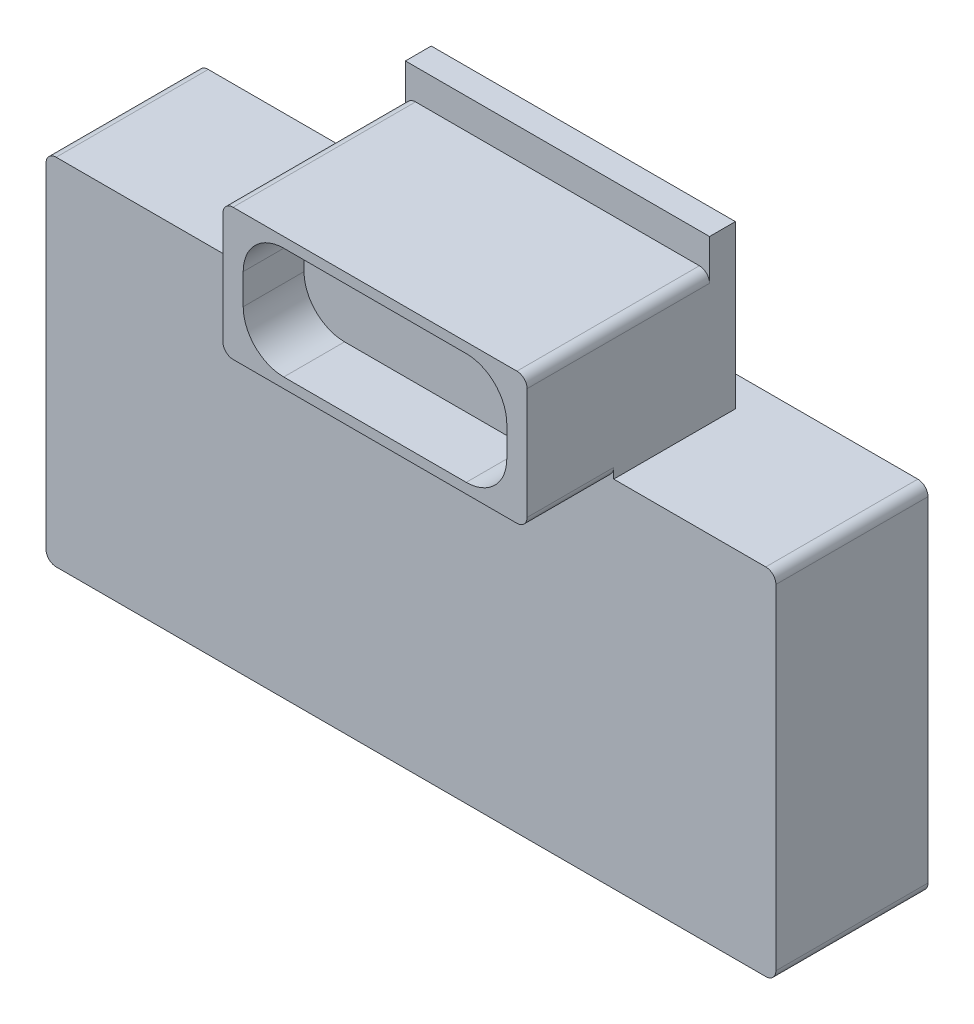
ISO-10303-21;
HEADER;
FILE_DESCRIPTION(('STEP AP214'),'2;1');
FILE_NAME('part.step','',(''),(''),'','','');
FILE_SCHEMA(('AUTOMOTIVE_DESIGN { 1 0 10303 214 1 1 1 1 }'));
ENDSEC;
DATA;
#1=APPLICATION_CONTEXT('core data for automotive mechanical design processes');
#2=APPLICATION_PROTOCOL_DEFINITION('international standard','automotive_design',2000,#1);
#3=PRODUCT_CONTEXT('',#1,'mechanical');
#4=PRODUCT('Part','Part','',(#3));
#5=PRODUCT_RELATED_PRODUCT_CATEGORY('part','',(#4));
#6=PRODUCT_DEFINITION_FORMATION('','',#4);
#7=PRODUCT_DEFINITION_CONTEXT('part definition',#1,'design');
#8=PRODUCT_DEFINITION('design','',#6,#7);
#9=PRODUCT_DEFINITION_SHAPE('','',#8);
#10=(LENGTH_UNIT() NAMED_UNIT(*) SI_UNIT(.MILLI.,.METRE.));
#11=(NAMED_UNIT(*) PLANE_ANGLE_UNIT() SI_UNIT($,.RADIAN.));
#12=(NAMED_UNIT(*) SI_UNIT($,.STERADIAN.) SOLID_ANGLE_UNIT());
#13=UNCERTAINTY_MEASURE_WITH_UNIT(LENGTH_MEASURE(1.E-05),#10,'distance_accuracy_value','');
#14=(GEOMETRIC_REPRESENTATION_CONTEXT(3) GLOBAL_UNCERTAINTY_ASSIGNED_CONTEXT((#13)) GLOBAL_UNIT_ASSIGNED_CONTEXT((#10,
#11,#12)) REPRESENTATION_CONTEXT('',''));
#15=CARTESIAN_POINT('',(0.,0.,0.));
#16=DIRECTION('',(0.,0.,1.));
#17=DIRECTION('',(1.,0.,0.));
#18=AXIS2_PLACEMENT_3D('',#15,#16,#17);
#19=CARTESIAN_POINT('',(0.,35.,15.));
#20=DIRECTION('',(0.,-1.,0.));
#21=DIRECTION('',(0.,0.,-1.));
#22=AXIS2_PLACEMENT_3D('',#19,#20,#21);
#23=PLANE('',#22);
#24=DIRECTION('',(-1.,0.,0.));
#25=VECTOR('',#24,1.);
#26=CARTESIAN_POINT('',(0.,35.,0.));
#27=LINE('',#26,#25);
#28=CARTESIAN_POINT('',(71.,35.,0.));
#29=VERTEX_POINT('',#28);
#30=CARTESIAN_POINT('',(1.,35.,0.));
#31=VERTEX_POINT('',#30);
#32=EDGE_CURVE('E281',#29,#31,#27,.T.);
#33=ORIENTED_EDGE('',*,*,#32,.T.);
#34=DIRECTION('',(0.,0.,-1.));
#35=VECTOR('',#34,1.);
#36=CARTESIAN_POINT('',(1.,35.,15.));
#37=LINE('',#36,#35);
#38=CARTESIAN_POINT('',(1.,35.,15.));
#39=VERTEX_POINT('',#38);
#40=EDGE_CURVE('E357',#31,#39,#37,.F.);
#41=ORIENTED_EDGE('',*,*,#40,.T.);
#42=DIRECTION('',(-1.,0.,0.));
#43=VECTOR('',#42,1.);
#44=CARTESIAN_POINT('',(0.,35.,15.));
#45=LINE('',#44,#43);
#46=CARTESIAN_POINT('',(22.,35.,15.));
#47=VERTEX_POINT('',#46);
#48=EDGE_CURVE('E251',#47,#39,#45,.T.);
#49=ORIENTED_EDGE('',*,*,#48,.F.);
#50=DIRECTION('',(0.,0.,1.));
#51=VECTOR('',#50,1.);
#52=CARTESIAN_POINT('',(22.,35.,3.));
#53=LINE('',#52,#51);
#54=CARTESIAN_POINT('',(22.,35.,3.));
#55=VERTEX_POINT('',#54);
#56=EDGE_CURVE('E336',#47,#55,#53,.F.);
#57=ORIENTED_EDGE('',*,*,#56,.T.);
#58=DIRECTION('',(-1.,0.,0.));
#59=VECTOR('',#58,1.);
#60=CARTESIAN_POINT('',(26.,35.,3.));
#61=LINE('',#60,#59);
#62=CARTESIAN_POINT('',(56.,35.,3.));
#63=VERTEX_POINT('',#62);
#64=EDGE_CURVE('E255',#63,#55,#61,.T.);
#65=ORIENTED_EDGE('',*,*,#64,.F.);
#66=DIRECTION('',(0.,0.,-1.));
#67=VECTOR('',#66,1.);
#68=CARTESIAN_POINT('',(56.,35.,3.));
#69=LINE('',#68,#67);
#70=CARTESIAN_POINT('',(56.,35.,15.));
#71=VERTEX_POINT('',#70);
#72=EDGE_CURVE('E233',#71,#63,#69,.T.);
#73=ORIENTED_EDGE('',*,*,#72,.F.);
#74=CARTESIAN_POINT('',(71.,35.,15.));
#75=VERTEX_POINT('',#74);
#76=EDGE_CURVE('E241',#75,#71,#45,.T.);
#77=ORIENTED_EDGE('',*,*,#76,.F.);
#78=DIRECTION('',(0.,0.,-1.));
#79=VECTOR('',#78,1.);
#80=CARTESIAN_POINT('',(71.,35.,15.));
#81=LINE('',#80,#79);
#82=EDGE_CURVE('E355',#75,#29,#81,.T.);
#83=ORIENTED_EDGE('',*,*,#82,.T.);
#84=EDGE_LOOP('',(#33,#41,#49,#57,#65,#73,#77,#83));
#85=FACE_BOUND('',#84,.T.);
#86=ADVANCED_FACE('F35',(#85),#23,.F.);
#87=CARTESIAN_POINT('',(26.,51.,5.54901565701342));
#88=DIRECTION('',(0.,0.,-1.));
#89=DIRECTION('',(-1.,0.,0.));
#90=AXIS2_PLACEMENT_3D('',#87,#88,#89);
#91=PLANE('',#90);
#92=DIRECTION('',(-1.,0.,0.));
#93=VECTOR('',#92,1.);
#94=CARTESIAN_POINT('',(26.,48.,5.54901565701342));
#95=LINE('',#94,#93);
#96=CARTESIAN_POINT('',(55.,48.,5.54901565701342));
#97=VERTEX_POINT('',#96);
#98=CARTESIAN_POINT('',(27.,48.,5.54901565701342));
#99=VERTEX_POINT('',#98);
#100=EDGE_CURVE('E406',#97,#99,#95,.T.);
#101=ORIENTED_EDGE('',*,*,#100,.F.);
#102=CARTESIAN_POINT('',(55.,47.,5.54901565701342));
#103=DIRECTION('',(0.,0.,-1.));
#104=DIRECTION('',(-1.,0.,0.));
#105=AXIS2_PLACEMENT_3D('',#102,#103,#104);
#106=CIRCLE('',#105,1.);
#107=CARTESIAN_POINT('',(56.,47.,5.54901565701342));
#108=VERTEX_POINT('',#107);
#109=EDGE_CURVE('E43',#97,#108,#106,.T.);
#110=ORIENTED_EDGE('',*,*,#109,.T.);
#111=DIRECTION('',(0.,-1.,0.));
#112=VECTOR('',#111,1.);
#113=CARTESIAN_POINT('',(56.,51.,5.54901565701342));
#114=LINE('',#113,#112);
#115=CARTESIAN_POINT('',(56.,51.,5.54901565701342));
#116=VERTEX_POINT('',#115);
#117=EDGE_CURVE('E272',#116,#108,#114,.T.);
#118=ORIENTED_EDGE('',*,*,#117,.F.);
#119=DIRECTION('',(1.,0.,0.));
#120=VECTOR('',#119,1.);
#121=CARTESIAN_POINT('',(26.,51.,5.54901565701342));
#122=LINE('',#121,#120);
#123=CARTESIAN_POINT('',(26.,51.,5.54901565701342));
#124=VERTEX_POINT('',#123);
#125=EDGE_CURVE('E428',#124,#116,#122,.T.);
#126=ORIENTED_EDGE('',*,*,#125,.F.);
#127=DIRECTION('',(0.,-1.,0.));
#128=VECTOR('',#127,1.);
#129=CARTESIAN_POINT('',(26.,51.,5.54901565701342));
#130=LINE('',#129,#128);
#131=CARTESIAN_POINT('',(26.,47.,5.54901565701342));
#132=VERTEX_POINT('',#131);
#133=EDGE_CURVE('E274',#124,#132,#130,.T.);
#134=ORIENTED_EDGE('',*,*,#133,.T.);
#135=CARTESIAN_POINT('',(27.,47.,5.54901565701342));
#136=DIRECTION('',(0.,0.,-1.));
#137=DIRECTION('',(-1.,0.,0.));
#138=AXIS2_PLACEMENT_3D('',#135,#136,#137);
#139=CIRCLE('',#138,1.);
#140=EDGE_CURVE('E11',#132,#99,#139,.T.);
#141=ORIENTED_EDGE('',*,*,#140,.T.);
#142=EDGE_LOOP('',(#101,#110,#118,#126,#134,#141));
#143=FACE_BOUND('',#142,.T.);
#144=ADVANCED_FACE('F404',(#143),#91,.F.);
#145=CARTESIAN_POINT('',(0.,0.,15.));
#146=DIRECTION('',(1.,0.,0.));
#147=DIRECTION('',(0.,0.,-1.));
#148=AXIS2_PLACEMENT_3D('',#145,#146,#147);
#149=PLANE('',#148);
#150=DIRECTION('',(0.,-1.,0.));
#151=VECTOR('',#150,1.);
#152=CARTESIAN_POINT('',(0.,0.,15.));
#153=LINE('',#152,#151);
#154=CARTESIAN_POINT('',(0.,34.,15.));
#155=VERTEX_POINT('',#154);
#156=CARTESIAN_POINT('',(0.,1.,15.));
#157=VERTEX_POINT('',#156);
#158=EDGE_CURVE('E277',#155,#157,#153,.T.);
#159=ORIENTED_EDGE('',*,*,#158,.F.);
#160=DIRECTION('',(0.,0.,-1.));
#161=VECTOR('',#160,1.);
#162=CARTESIAN_POINT('',(0.,34.,15.));
#163=LINE('',#162,#161);
#164=CARTESIAN_POINT('',(0.,34.,0.));
#165=VERTEX_POINT('',#164);
#166=EDGE_CURVE('E344',#155,#165,#163,.T.);
#167=ORIENTED_EDGE('',*,*,#166,.T.);
#168=DIRECTION('',(0.,-1.,0.));
#169=VECTOR('',#168,1.);
#170=CARTESIAN_POINT('',(0.,0.,0.));
#171=LINE('',#170,#169);
#172=CARTESIAN_POINT('',(0.,1.,0.));
#173=VERTEX_POINT('',#172);
#174=EDGE_CURVE('E276',#165,#173,#171,.T.);
#175=ORIENTED_EDGE('',*,*,#174,.T.);
#176=DIRECTION('',(0.,0.,-1.));
#177=VECTOR('',#176,1.);
#178=CARTESIAN_POINT('',(0.,1.,15.));
#179=LINE('',#178,#177);
#180=EDGE_CURVE('E342',#173,#157,#179,.F.);
#181=ORIENTED_EDGE('',*,*,#180,.T.);
#182=EDGE_LOOP('',(#159,#167,#175,#181));
#183=FACE_BOUND('',#182,.T.);
#184=ADVANCED_FACE('F528',(#183),#149,.F.);
#185=CARTESIAN_POINT('',(0.,0.,15.));
#186=DIRECTION('',(0.,1.,0.));
#187=DIRECTION('',(0.,0.,1.));
#188=AXIS2_PLACEMENT_3D('',#185,#186,#187);
#189=PLANE('',#188);
#190=DIRECTION('',(1.,0.,0.));
#191=VECTOR('',#190,1.);
#192=CARTESIAN_POINT('',(0.,0.,15.));
#193=LINE('',#192,#191);
#194=CARTESIAN_POINT('',(1.,0.,15.));
#195=VERTEX_POINT('',#194);
#196=CARTESIAN_POINT('',(71.,0.,15.));
#197=VERTEX_POINT('',#196);
#198=EDGE_CURVE('E280',#195,#197,#193,.T.);
#199=ORIENTED_EDGE('',*,*,#198,.F.);
#200=DIRECTION('',(0.,0.,-1.));
#201=VECTOR('',#200,1.);
#202=CARTESIAN_POINT('',(1.,0.,15.));
#203=LINE('',#202,#201);
#204=CARTESIAN_POINT('',(1.,0.,0.));
#205=VERTEX_POINT('',#204);
#206=EDGE_CURVE('E368',#195,#205,#203,.T.);
#207=ORIENTED_EDGE('',*,*,#206,.T.);
#208=DIRECTION('',(1.,0.,0.));
#209=VECTOR('',#208,1.);
#210=CARTESIAN_POINT('',(0.,0.,0.));
#211=LINE('',#210,#209);
#212=CARTESIAN_POINT('',(71.,0.,0.));
#213=VERTEX_POINT('',#212);
#214=EDGE_CURVE('E288',#205,#213,#211,.T.);
#215=ORIENTED_EDGE('',*,*,#214,.T.);
#216=DIRECTION('',(0.,0.,-1.));
#217=VECTOR('',#216,1.);
#218=CARTESIAN_POINT('',(71.,0.,15.));
#219=LINE('',#218,#217);
#220=EDGE_CURVE('E366',#213,#197,#219,.F.);
#221=ORIENTED_EDGE('',*,*,#220,.T.);
#222=EDGE_LOOP('',(#199,#207,#215,#221));
#223=FACE_BOUND('',#222,.T.);
#224=ADVANCED_FACE('F537',(#223),#189,.F.);
#225=CARTESIAN_POINT('',(72.,0.,15.));
#226=DIRECTION('',(-1.,0.,0.));
#227=DIRECTION('',(0.,0.,1.));
#228=AXIS2_PLACEMENT_3D('',#225,#226,#227);
#229=PLANE('',#228);
#230=DIRECTION('',(0.,1.,0.));
#231=VECTOR('',#230,1.);
#232=CARTESIAN_POINT('',(72.,0.,15.));
#233=LINE('',#232,#231);
#234=CARTESIAN_POINT('',(72.,1.,15.));
#235=VERTEX_POINT('',#234);
#236=CARTESIAN_POINT('',(72.,34.,15.));
#237=VERTEX_POINT('',#236);
#238=EDGE_CURVE('E284',#235,#237,#233,.T.);
#239=ORIENTED_EDGE('',*,*,#238,.F.);
#240=DIRECTION('',(0.,0.,-1.));
#241=VECTOR('',#240,1.);
#242=CARTESIAN_POINT('',(72.,1.,15.));
#243=LINE('',#242,#241);
#244=CARTESIAN_POINT('',(72.,1.,0.));
#245=VERTEX_POINT('',#244);
#246=EDGE_CURVE('E373',#235,#245,#243,.T.);
#247=ORIENTED_EDGE('',*,*,#246,.T.);
#248=DIRECTION('',(0.,1.,0.));
#249=VECTOR('',#248,1.);
#250=CARTESIAN_POINT('',(72.,0.,0.));
#251=LINE('',#250,#249);
#252=CARTESIAN_POINT('',(72.,34.,0.));
#253=VERTEX_POINT('',#252);
#254=EDGE_CURVE('E291',#245,#253,#251,.T.);
#255=ORIENTED_EDGE('',*,*,#254,.T.);
#256=DIRECTION('',(0.,0.,-1.));
#257=VECTOR('',#256,1.);
#258=CARTESIAN_POINT('',(72.,34.,15.));
#259=LINE('',#258,#257);
#260=EDGE_CURVE('E371',#253,#237,#259,.F.);
#261=ORIENTED_EDGE('',*,*,#260,.T.);
#262=EDGE_LOOP('',(#239,#247,#255,#261));
#263=FACE_BOUND('',#262,.T.);
#264=ADVANCED_FACE('F534',(#263),#229,.F.);
#265=CARTESIAN_POINT('',(0.,0.,15.));
#266=DIRECTION('',(0.,0.,-1.));
#267=DIRECTION('',(-1.,0.,0.));
#268=AXIS2_PLACEMENT_3D('',#265,#266,#267);
#269=PLANE('',#268);
#270=ORIENTED_EDGE('',*,*,#48,.T.);
#271=CARTESIAN_POINT('',(1.,34.,15.));
#272=DIRECTION('',(0.,0.,-1.));
#273=DIRECTION('',(-1.,0.,0.));
#274=AXIS2_PLACEMENT_3D('',#271,#272,#273);
#275=CIRCLE('',#274,1.);
#276=EDGE_CURVE('E364',#39,#155,#275,.F.);
#277=ORIENTED_EDGE('',*,*,#276,.T.);
#278=ORIENTED_EDGE('',*,*,#158,.T.);
#279=CARTESIAN_POINT('',(1.,1.,15.));
#280=DIRECTION('',(0.,0.,-1.));
#281=DIRECTION('',(-1.,0.,0.));
#282=AXIS2_PLACEMENT_3D('',#279,#280,#281);
#283=CIRCLE('',#282,1.);
#284=EDGE_CURVE('E362',#157,#195,#283,.F.);
#285=ORIENTED_EDGE('',*,*,#284,.T.);
#286=ORIENTED_EDGE('',*,*,#198,.T.);
#287=CARTESIAN_POINT('',(71.,1.,15.));
#288=DIRECTION('',(0.,0.,-1.));
#289=DIRECTION('',(-1.,0.,0.));
#290=AXIS2_PLACEMENT_3D('',#287,#288,#289);
#291=CIRCLE('',#290,1.);
#292=EDGE_CURVE('E360',#197,#235,#291,.F.);
#293=ORIENTED_EDGE('',*,*,#292,.T.);
#294=ORIENTED_EDGE('',*,*,#238,.T.);
#295=CARTESIAN_POINT('',(71.,34.,15.));
#296=DIRECTION('',(0.,0.,-1.));
#297=DIRECTION('',(-1.,0.,0.));
#298=AXIS2_PLACEMENT_3D('',#295,#296,#297);
#299=CIRCLE('',#298,1.);
#300=EDGE_CURVE('E246',#237,#75,#299,.F.);
#301=ORIENTED_EDGE('',*,*,#300,.T.);
#302=ORIENTED_EDGE('',*,*,#76,.T.);
#303=DIRECTION('',(0.,-1.,0.));
#304=VECTOR('',#303,1.);
#305=CARTESIAN_POINT('',(56.,51.,15.));
#306=LINE('',#305,#304);
#307=CARTESIAN_POINT('',(56.,36.,15.));
#308=VERTEX_POINT('',#307);
#309=EDGE_CURVE('E227',#308,#71,#306,.T.);
#310=ORIENTED_EDGE('',*,*,#309,.F.);
#311=CARTESIAN_POINT('',(55.,36.,15.));
#312=DIRECTION('',(0.,0.,-1.));
#313=DIRECTION('',(-1.,0.,0.));
#314=AXIS2_PLACEMENT_3D('',#311,#312,#313);
#315=CIRCLE('',#314,1.);
#316=CARTESIAN_POINT('',(55.,35.,15.));
#317=VERTEX_POINT('',#316);
#318=EDGE_CURVE('E400',#308,#317,#315,.T.);
#319=ORIENTED_EDGE('',*,*,#318,.T.);
#320=DIRECTION('',(1.,0.,0.));
#321=VECTOR('',#320,1.);
#322=CARTESIAN_POINT('',(0.,35.,15.));
#323=LINE('',#322,#321);
#324=CARTESIAN_POINT('',(27.,35.,15.));
#325=VERTEX_POINT('',#324);
#326=EDGE_CURVE('E256',#325,#317,#323,.T.);
#327=ORIENTED_EDGE('',*,*,#326,.F.);
#328=CARTESIAN_POINT('',(27.,36.,15.));
#329=DIRECTION('',(0.,0.,-1.));
#330=DIRECTION('',(-1.,0.,0.));
#331=AXIS2_PLACEMENT_3D('',#328,#329,#330);
#332=CIRCLE('',#331,1.);
#333=CARTESIAN_POINT('',(26.,36.,15.));
#334=VERTEX_POINT('',#333);
#335=EDGE_CURVE('E402',#325,#334,#332,.T.);
#336=ORIENTED_EDGE('',*,*,#335,.T.);
#337=DIRECTION('',(0.,-1.,0.));
#338=VECTOR('',#337,1.);
#339=CARTESIAN_POINT('',(26.,0.,15.));
#340=LINE('',#339,#338);
#341=CARTESIAN_POINT('',(26.,39.,15.));
#342=VERTEX_POINT('',#341);
#343=EDGE_CURVE('E330',#342,#334,#340,.T.);
#344=ORIENTED_EDGE('',*,*,#343,.F.);
#345=CARTESIAN_POINT('',(22.,39.,15.));
#346=DIRECTION('',(0.,0.,-1.));
#347=DIRECTION('',(-1.,0.,0.));
#348=AXIS2_PLACEMENT_3D('',#345,#346,#347);
#349=CIRCLE('',#348,4.);
#350=EDGE_CURVE('E338',#342,#47,#349,.T.);
#351=ORIENTED_EDGE('',*,*,#350,.T.);
#352=EDGE_LOOP('',(#270,#277,#278,#285,#286,#293,#294,#301,#302,#310,#319,#327,#336,#344,#351));
#353=FACE_BOUND('',#352,.T.);
#354=ADVANCED_FACE('F243',(#353),#269,.F.);
#355=CARTESIAN_POINT('',(0.,0.,0.));
#356=DIRECTION('',(0.,0.,-1.));
#357=DIRECTION('',(-1.,0.,0.));
#358=AXIS2_PLACEMENT_3D('',#355,#356,#357);
#359=PLANE('',#358);
#360=ORIENTED_EDGE('',*,*,#174,.F.);
#361=CARTESIAN_POINT('',(1.,34.,0.));
#362=DIRECTION('',(0.,0.,-1.));
#363=DIRECTION('',(-1.,0.,0.));
#364=AXIS2_PLACEMENT_3D('',#361,#362,#363);
#365=CIRCLE('',#364,1.);
#366=EDGE_CURVE('E353',#165,#31,#365,.T.);
#367=ORIENTED_EDGE('',*,*,#366,.T.);
#368=ORIENTED_EDGE('',*,*,#32,.F.);
#369=CARTESIAN_POINT('',(71.,34.,0.));
#370=DIRECTION('',(0.,0.,-1.));
#371=DIRECTION('',(-1.,0.,0.));
#372=AXIS2_PLACEMENT_3D('',#369,#370,#371);
#373=CIRCLE('',#372,1.);
#374=EDGE_CURVE('E347',#29,#253,#373,.T.);
#375=ORIENTED_EDGE('',*,*,#374,.T.);
#376=ORIENTED_EDGE('',*,*,#254,.F.);
#377=CARTESIAN_POINT('',(71.,1.,0.));
#378=DIRECTION('',(0.,0.,-1.));
#379=DIRECTION('',(-1.,0.,0.));
#380=AXIS2_PLACEMENT_3D('',#377,#378,#379);
#381=CIRCLE('',#380,1.);
#382=EDGE_CURVE('E349',#245,#213,#381,.T.);
#383=ORIENTED_EDGE('',*,*,#382,.T.);
#384=ORIENTED_EDGE('',*,*,#214,.F.);
#385=CARTESIAN_POINT('',(1.,1.,0.));
#386=DIRECTION('',(0.,0.,-1.));
#387=DIRECTION('',(-1.,0.,0.));
#388=AXIS2_PLACEMENT_3D('',#385,#386,#387);
#389=CIRCLE('',#388,1.);
#390=EDGE_CURVE('E351',#205,#173,#389,.T.);
#391=ORIENTED_EDGE('',*,*,#390,.T.);
#392=EDGE_LOOP('',(#360,#367,#368,#375,#376,#383,#384,#391));
#393=FACE_BOUND('',#392,.T.);
#394=ADVANCED_FACE('F532',(#393),#359,.T.);
#395=CARTESIAN_POINT('',(26.,51.,3.));
#396=DIRECTION('',(1.,0.,0.));
#397=DIRECTION('',(0.,0.,-1.));
#398=AXIS2_PLACEMENT_3D('',#395,#396,#397);
#399=PLANE('',#398);
#400=ORIENTED_EDGE('',*,*,#343,.T.);
#401=DIRECTION('',(0.,0.,-1.));
#402=VECTOR('',#401,1.);
#403=CARTESIAN_POINT('',(26.,36.,3.));
#404=LINE('',#403,#402);
#405=CARTESIAN_POINT('',(26.,36.,23.5490156570134));
#406=VERTEX_POINT('',#405);
#407=EDGE_CURVE('E394',#334,#406,#404,.F.);
#408=ORIENTED_EDGE('',*,*,#407,.T.);
#409=DIRECTION('',(0.,-1.,0.));
#410=VECTOR('',#409,1.);
#411=CARTESIAN_POINT('',(26.,35.,23.5490156570134));
#412=LINE('',#411,#410);
#413=CARTESIAN_POINT('',(26.,47.,23.5490156570134));
#414=VERTEX_POINT('',#413);
#415=EDGE_CURVE('E420',#414,#406,#412,.T.);
#416=ORIENTED_EDGE('',*,*,#415,.F.);
#417=DIRECTION('',(0.,0.,-1.));
#418=VECTOR('',#417,1.);
#419=CARTESIAN_POINT('',(26.,47.,3.));
#420=LINE('',#419,#418);
#421=EDGE_CURVE('E391',#414,#132,#420,.T.);
#422=ORIENTED_EDGE('',*,*,#421,.T.);
#423=ORIENTED_EDGE('',*,*,#133,.F.);
#424=DIRECTION('',(0.,0.,1.));
#425=VECTOR('',#424,1.);
#426=CARTESIAN_POINT('',(26.,51.,3.));
#427=LINE('',#426,#425);
#428=CARTESIAN_POINT('',(26.,51.,3.));
#429=VERTEX_POINT('',#428);
#430=EDGE_CURVE('E258',#429,#124,#427,.T.);
#431=ORIENTED_EDGE('',*,*,#430,.F.);
#432=DIRECTION('',(0.,-1.,0.));
#433=VECTOR('',#432,1.);
#434=CARTESIAN_POINT('',(26.,51.,3.));
#435=LINE('',#434,#433);
#436=CARTESIAN_POINT('',(26.,39.,3.));
#437=VERTEX_POINT('',#436);
#438=EDGE_CURVE('E267',#429,#437,#435,.T.);
#439=ORIENTED_EDGE('',*,*,#438,.T.);
#440=DIRECTION('',(0.,0.,1.));
#441=VECTOR('',#440,1.);
#442=CARTESIAN_POINT('',(26.,39.,15.));
#443=LINE('',#442,#441);
#444=EDGE_CURVE('E333',#437,#342,#443,.T.);
#445=ORIENTED_EDGE('',*,*,#444,.T.);
#446=EDGE_LOOP('',(#400,#408,#416,#422,#423,#431,#439,#445));
#447=FACE_BOUND('',#446,.T.);
#448=ADVANCED_FACE('F441',(#447),#399,.F.);
#449=CARTESIAN_POINT('',(56.,51.,3.));
#450=DIRECTION('',(-1.,0.,0.));
#451=DIRECTION('',(0.,0.,1.));
#452=AXIS2_PLACEMENT_3D('',#449,#450,#451);
#453=PLANE('',#452);
#454=DIRECTION('',(0.,1.,0.));
#455=VECTOR('',#454,1.);
#456=CARTESIAN_POINT('',(56.,35.,23.5490156570134));
#457=LINE('',#456,#455);
#458=CARTESIAN_POINT('',(56.,36.,23.5490156570134));
#459=VERTEX_POINT('',#458);
#460=CARTESIAN_POINT('',(56.,47.,23.5490156570134));
#461=VERTEX_POINT('',#460);
#462=EDGE_CURVE('E410',#459,#461,#457,.T.);
#463=ORIENTED_EDGE('',*,*,#462,.F.);
#464=DIRECTION('',(0.,0.,-1.));
#465=VECTOR('',#464,1.);
#466=CARTESIAN_POINT('',(56.,36.,3.));
#467=LINE('',#466,#465);
#468=EDGE_CURVE('E236',#459,#308,#467,.T.);
#469=ORIENTED_EDGE('',*,*,#468,.T.);
#470=ORIENTED_EDGE('',*,*,#309,.T.);
#471=ORIENTED_EDGE('',*,*,#72,.T.);
#472=DIRECTION('',(0.,-1.,0.));
#473=VECTOR('',#472,1.);
#474=CARTESIAN_POINT('',(56.,51.,3.));
#475=LINE('',#474,#473);
#476=CARTESIAN_POINT('',(56.,51.,3.));
#477=VERTEX_POINT('',#476);
#478=EDGE_CURVE('E270',#477,#63,#475,.T.);
#479=ORIENTED_EDGE('',*,*,#478,.F.);
#480=DIRECTION('',(0.,0.,-1.));
#481=VECTOR('',#480,1.);
#482=CARTESIAN_POINT('',(56.,51.,3.));
#483=LINE('',#482,#481);
#484=EDGE_CURVE('E429',#116,#477,#483,.T.);
#485=ORIENTED_EDGE('',*,*,#484,.F.);
#486=ORIENTED_EDGE('',*,*,#117,.T.);
#487=DIRECTION('',(0.,0.,-1.));
#488=VECTOR('',#487,1.);
#489=CARTESIAN_POINT('',(56.,47.,3.));
#490=LINE('',#489,#488);
#491=EDGE_CURVE('E238',#108,#461,#490,.F.);
#492=ORIENTED_EDGE('',*,*,#491,.T.);
#493=EDGE_LOOP('',(#463,#469,#470,#471,#479,#485,#486,#492));
#494=FACE_BOUND('',#493,.T.);
#495=ADVANCED_FACE('F230',(#494),#453,.F.);
#496=CARTESIAN_POINT('',(26.,51.,3.));
#497=DIRECTION('',(0.,0.,1.));
#498=DIRECTION('',(1.,0.,0.));
#499=AXIS2_PLACEMENT_3D('',#496,#497,#498);
#500=PLANE('',#499);
#501=ORIENTED_EDGE('',*,*,#64,.T.);
#502=CARTESIAN_POINT('',(22.,39.,3.));
#503=DIRECTION('',(0.,0.,1.));
#504=DIRECTION('',(1.,0.,0.));
#505=AXIS2_PLACEMENT_3D('',#502,#503,#504);
#506=CIRCLE('',#505,4.);
#507=EDGE_CURVE('E340',#55,#437,#506,.T.);
#508=ORIENTED_EDGE('',*,*,#507,.T.);
#509=ORIENTED_EDGE('',*,*,#438,.F.);
#510=DIRECTION('',(-1.,0.,0.));
#511=VECTOR('',#510,1.);
#512=CARTESIAN_POINT('',(26.,51.,3.));
#513=LINE('',#512,#511);
#514=EDGE_CURVE('E264',#477,#429,#513,.T.);
#515=ORIENTED_EDGE('',*,*,#514,.F.);
#516=ORIENTED_EDGE('',*,*,#478,.T.);
#517=EDGE_LOOP('',(#501,#508,#509,#515,#516));
#518=FACE_BOUND('',#517,.T.);
#519=ADVANCED_FACE('F437',(#518),#500,.F.);
#520=CARTESIAN_POINT('',(0.,51.,0.));
#521=DIRECTION('',(0.,1.,0.));
#522=DIRECTION('',(0.,0.,1.));
#523=AXIS2_PLACEMENT_3D('',#520,#521,#522);
#524=PLANE('',#523);
#525=ORIENTED_EDGE('',*,*,#430,.T.);
#526=ORIENTED_EDGE('',*,*,#125,.T.);
#527=ORIENTED_EDGE('',*,*,#484,.T.);
#528=ORIENTED_EDGE('',*,*,#514,.T.);
#529=EDGE_LOOP('',(#525,#526,#527,#528));
#530=FACE_BOUND('',#529,.T.);
#531=ADVANCED_FACE('F433',(#530),#524,.T.);
#532=CARTESIAN_POINT('',(26.,35.,23.5490156570134));
#533=DIRECTION('',(0.,1.,0.));
#534=DIRECTION('',(0.,0.,1.));
#535=AXIS2_PLACEMENT_3D('',#532,#533,#534);
#536=PLANE('',#535);
#537=ORIENTED_EDGE('',*,*,#326,.T.);
#538=DIRECTION('',(0.,0.,-1.));
#539=VECTOR('',#538,1.);
#540=CARTESIAN_POINT('',(55.,35.,23.5490156570134));
#541=LINE('',#540,#539);
#542=CARTESIAN_POINT('',(55.,35.,23.5490156570134));
#543=VERTEX_POINT('',#542);
#544=EDGE_CURVE('E381',#317,#543,#541,.F.);
#545=ORIENTED_EDGE('',*,*,#544,.T.);
#546=DIRECTION('',(1.,0.,0.));
#547=VECTOR('',#546,1.);
#548=CARTESIAN_POINT('',(26.,35.,23.5490156570134));
#549=LINE('',#548,#547);
#550=CARTESIAN_POINT('',(27.,35.,23.5490156570134));
#551=VERTEX_POINT('',#550);
#552=EDGE_CURVE('E417',#551,#543,#549,.T.);
#553=ORIENTED_EDGE('',*,*,#552,.F.);
#554=DIRECTION('',(0.,0.,-1.));
#555=VECTOR('',#554,1.);
#556=CARTESIAN_POINT('',(27.,35.,23.5490156570134));
#557=LINE('',#556,#555);
#558=EDGE_CURVE('E378',#551,#325,#557,.T.);
#559=ORIENTED_EDGE('',*,*,#558,.T.);
#560=EDGE_LOOP('',(#537,#545,#553,#559));
#561=FACE_BOUND('',#560,.T.);
#562=ADVANCED_FACE('F643',(#561),#536,.F.);
#563=CARTESIAN_POINT('',(26.,48.,23.5490156570134));
#564=DIRECTION('',(0.,-1.,0.));
#565=DIRECTION('',(0.,0.,-1.));
#566=AXIS2_PLACEMENT_3D('',#563,#564,#565);
#567=PLANE('',#566);
#568=DIRECTION('',(-1.,0.,0.));
#569=VECTOR('',#568,1.);
#570=CARTESIAN_POINT('',(26.,48.,23.5490156570134));
#571=LINE('',#570,#569);
#572=CARTESIAN_POINT('',(55.,48.,23.5490156570134));
#573=VERTEX_POINT('',#572);
#574=CARTESIAN_POINT('',(27.,48.,23.5490156570134));
#575=VERTEX_POINT('',#574);
#576=EDGE_CURVE('E261',#573,#575,#571,.T.);
#577=ORIENTED_EDGE('',*,*,#576,.F.);
#578=DIRECTION('',(0.,0.,-1.));
#579=VECTOR('',#578,1.);
#580=CARTESIAN_POINT('',(55.,48.,23.5490156570134));
#581=LINE('',#580,#579);
#582=EDGE_CURVE('E398',#573,#97,#581,.T.);
#583=ORIENTED_EDGE('',*,*,#582,.T.);
#584=ORIENTED_EDGE('',*,*,#100,.T.);
#585=DIRECTION('',(0.,0.,-1.));
#586=VECTOR('',#585,1.);
#587=CARTESIAN_POINT('',(27.,48.,23.5490156570134));
#588=LINE('',#587,#586);
#589=EDGE_CURVE('E396',#99,#575,#588,.F.);
#590=ORIENTED_EDGE('',*,*,#589,.T.);
#591=EDGE_LOOP('',(#577,#583,#584,#590));
#592=FACE_BOUND('',#591,.T.);
#593=ADVANCED_FACE('F448',(#592),#567,.F.);
#594=CARTESIAN_POINT('',(0.,0.,23.5490156570134));
#595=DIRECTION('',(0.,0.,-1.));
#596=DIRECTION('',(-1.,0.,0.));
#597=AXIS2_PLACEMENT_3D('',#594,#595,#596);
#598=PLANE('',#597);
#599=DIRECTION('',(1.,0.,0.));
#600=VECTOR('',#599,1.);
#601=CARTESIAN_POINT('',(28.,36.,23.5490156570134));
#602=LINE('',#601,#600);
#603=CARTESIAN_POINT('',(32.,36.,23.5490156570134));
#604=VERTEX_POINT('',#603);
#605=CARTESIAN_POINT('',(50.,36.,23.5490156570134));
#606=VERTEX_POINT('',#605);
#607=EDGE_CURVE('E460',#604,#606,#602,.T.);
#608=ORIENTED_EDGE('',*,*,#607,.F.);
#609=CARTESIAN_POINT('',(32.,40.,23.5490156570134));
#610=DIRECTION('',(0.,0.,-1.));
#611=DIRECTION('',(-1.,0.,0.));
#612=AXIS2_PLACEMENT_3D('',#609,#610,#611);
#613=CIRCLE('',#612,4.);
#614=CARTESIAN_POINT('',(28.,40.,23.5490156570134));
#615=VERTEX_POINT('',#614);
#616=EDGE_CURVE('E326',#604,#615,#613,.T.);
#617=ORIENTED_EDGE('',*,*,#616,.T.);
#618=DIRECTION('',(0.,-1.,0.));
#619=VECTOR('',#618,1.);
#620=CARTESIAN_POINT('',(28.,36.,23.5490156570134));
#621=LINE('',#620,#619);
#622=CARTESIAN_POINT('',(28.,43.,23.5490156570134));
#623=VERTEX_POINT('',#622);
#624=EDGE_CURVE('E463',#623,#615,#621,.T.);
#625=ORIENTED_EDGE('',*,*,#624,.F.);
#626=CARTESIAN_POINT('',(32.,43.,23.5490156570134));
#627=DIRECTION('',(0.,0.,-1.));
#628=DIRECTION('',(-1.,0.,0.));
#629=AXIS2_PLACEMENT_3D('',#626,#627,#628);
#630=CIRCLE('',#629,4.);
#631=CARTESIAN_POINT('',(32.,47.,23.5490156570134));
#632=VERTEX_POINT('',#631);
#633=EDGE_CURVE('E328',#623,#632,#630,.T.);
#634=ORIENTED_EDGE('',*,*,#633,.T.);
#635=DIRECTION('',(-1.,0.,0.));
#636=VECTOR('',#635,1.);
#637=CARTESIAN_POINT('',(28.,47.,23.5490156570134));
#638=LINE('',#637,#636);
#639=CARTESIAN_POINT('',(50.,47.,23.5490156570134));
#640=VERTEX_POINT('',#639);
#641=EDGE_CURVE('E453',#640,#632,#638,.T.);
#642=ORIENTED_EDGE('',*,*,#641,.F.);
#643=CARTESIAN_POINT('',(50.,43.,23.5490156570134));
#644=DIRECTION('',(0.,0.,-1.));
#645=DIRECTION('',(-1.,0.,0.));
#646=AXIS2_PLACEMENT_3D('',#643,#644,#645);
#647=CIRCLE('',#646,4.);
#648=CARTESIAN_POINT('',(54.,43.,23.5490156570134));
#649=VERTEX_POINT('',#648);
#650=EDGE_CURVE('E324',#640,#649,#647,.T.);
#651=ORIENTED_EDGE('',*,*,#650,.T.);
#652=DIRECTION('',(0.,1.,0.));
#653=VECTOR('',#652,1.);
#654=CARTESIAN_POINT('',(54.,36.,23.5490156570134));
#655=LINE('',#654,#653);
#656=CARTESIAN_POINT('',(54.,40.,23.5490156570134));
#657=VERTEX_POINT('',#656);
#658=EDGE_CURVE('E457',#657,#649,#655,.T.);
#659=ORIENTED_EDGE('',*,*,#658,.F.);
#660=CARTESIAN_POINT('',(50.,40.,23.5490156570134));
#661=DIRECTION('',(0.,0.,-1.));
#662=DIRECTION('',(-1.,0.,0.));
#663=AXIS2_PLACEMENT_3D('',#660,#661,#662);
#664=CIRCLE('',#663,4.);
#665=EDGE_CURVE('E322',#657,#606,#664,.T.);
#666=ORIENTED_EDGE('',*,*,#665,.T.);
#667=EDGE_LOOP('',(#608,#617,#625,#634,#642,#651,#659,#666));
#668=FACE_BOUND('',#667,.T.);
#669=ORIENTED_EDGE('',*,*,#552,.T.);
#670=CARTESIAN_POINT('',(55.,36.,23.5490156570134));
#671=DIRECTION('',(0.,0.,-1.));
#672=DIRECTION('',(-1.,0.,0.));
#673=AXIS2_PLACEMENT_3D('',#670,#671,#672);
#674=CIRCLE('',#673,1.);
#675=EDGE_CURVE('E389',#543,#459,#674,.F.);
#676=ORIENTED_EDGE('',*,*,#675,.T.);
#677=ORIENTED_EDGE('',*,*,#462,.T.);
#678=CARTESIAN_POINT('',(55.,47.,23.5490156570134));
#679=DIRECTION('',(0.,0.,-1.));
#680=DIRECTION('',(-1.,0.,0.));
#681=AXIS2_PLACEMENT_3D('',#678,#679,#680);
#682=CIRCLE('',#681,1.);
#683=EDGE_CURVE('E385',#461,#573,#682,.F.);
#684=ORIENTED_EDGE('',*,*,#683,.T.);
#685=ORIENTED_EDGE('',*,*,#576,.T.);
#686=CARTESIAN_POINT('',(27.,47.,23.5490156570134));
#687=DIRECTION('',(0.,0.,-1.));
#688=DIRECTION('',(-1.,0.,0.));
#689=AXIS2_PLACEMENT_3D('',#686,#687,#688);
#690=CIRCLE('',#689,1.);
#691=EDGE_CURVE('E383',#575,#414,#690,.F.);
#692=ORIENTED_EDGE('',*,*,#691,.T.);
#693=ORIENTED_EDGE('',*,*,#415,.T.);
#694=CARTESIAN_POINT('',(27.,36.,23.5490156570134));
#695=DIRECTION('',(0.,0.,-1.));
#696=DIRECTION('',(-1.,0.,0.));
#697=AXIS2_PLACEMENT_3D('',#694,#695,#696);
#698=CIRCLE('',#697,1.);
#699=EDGE_CURVE('E387',#406,#551,#698,.F.);
#700=ORIENTED_EDGE('',*,*,#699,.T.);
#701=EDGE_LOOP('',(#669,#676,#677,#684,#685,#692,#693,#700));
#702=FACE_BOUND('',#701,.T.);
#703=ADVANCED_FACE('F413',(#668,#702),#598,.F.);
#704=CARTESIAN_POINT('',(28.,36.,17.5490156570134));
#705=DIRECTION('',(-1.,0.,0.));
#706=DIRECTION('',(0.,0.,1.));
#707=AXIS2_PLACEMENT_3D('',#704,#705,#706);
#708=PLANE('',#707);
#709=ORIENTED_EDGE('',*,*,#624,.T.);
#710=DIRECTION('',(0.,0.,1.));
#711=VECTOR('',#710,1.);
#712=CARTESIAN_POINT('',(28.,40.,17.5490156570134));
#713=LINE('',#712,#711);
#714=CARTESIAN_POINT('',(28.,40.,17.5490156570134));
#715=VERTEX_POINT('',#714);
#716=EDGE_CURVE('E320',#615,#715,#713,.F.);
#717=ORIENTED_EDGE('',*,*,#716,.T.);
#718=DIRECTION('',(0.,-1.,0.));
#719=VECTOR('',#718,1.);
#720=CARTESIAN_POINT('',(28.,36.,17.5490156570134));
#721=LINE('',#720,#719);
#722=CARTESIAN_POINT('',(28.,43.,17.5490156570134));
#723=VERTEX_POINT('',#722);
#724=EDGE_CURVE('E456',#723,#715,#721,.T.);
#725=ORIENTED_EDGE('',*,*,#724,.F.);
#726=DIRECTION('',(0.,0.,1.));
#727=VECTOR('',#726,1.);
#728=CARTESIAN_POINT('',(28.,43.,23.5490156570134));
#729=LINE('',#728,#727);
#730=EDGE_CURVE('E317',#723,#623,#729,.T.);
#731=ORIENTED_EDGE('',*,*,#730,.T.);
#732=EDGE_LOOP('',(#709,#717,#725,#731));
#733=FACE_BOUND('',#732,.T.);
#734=ADVANCED_FACE('F513',(#733),#708,.F.);
#735=CARTESIAN_POINT('',(28.,47.,17.5490156570134));
#736=DIRECTION('',(0.,1.,0.));
#737=DIRECTION('',(0.,0.,1.));
#738=AXIS2_PLACEMENT_3D('',#735,#736,#737);
#739=PLANE('',#738);
#740=DIRECTION('',(-1.,0.,0.));
#741=VECTOR('',#740,1.);
#742=CARTESIAN_POINT('',(28.,47.,17.5490156570134));
#743=LINE('',#742,#741);
#744=CARTESIAN_POINT('',(50.,47.,17.5490156570134));
#745=VERTEX_POINT('',#744);
#746=CARTESIAN_POINT('',(32.,47.,17.5490156570134));
#747=VERTEX_POINT('',#746);
#748=EDGE_CURVE('E424',#745,#747,#743,.T.);
#749=ORIENTED_EDGE('',*,*,#748,.F.);
#750=DIRECTION('',(0.,0.,1.));
#751=VECTOR('',#750,1.);
#752=CARTESIAN_POINT('',(50.,47.,23.5490156570134));
#753=LINE('',#752,#751);
#754=EDGE_CURVE('E314',#745,#640,#753,.T.);
#755=ORIENTED_EDGE('',*,*,#754,.T.);
#756=ORIENTED_EDGE('',*,*,#641,.T.);
#757=DIRECTION('',(0.,0.,1.));
#758=VECTOR('',#757,1.);
#759=CARTESIAN_POINT('',(32.,47.,17.5490156570134));
#760=LINE('',#759,#758);
#761=EDGE_CURVE('E312',#632,#747,#760,.F.);
#762=ORIENTED_EDGE('',*,*,#761,.T.);
#763=EDGE_LOOP('',(#749,#755,#756,#762));
#764=FACE_BOUND('',#763,.T.);
#765=ADVANCED_FACE('F509',(#764),#739,.F.);
#766=CARTESIAN_POINT('',(54.,36.,17.5490156570134));
#767=DIRECTION('',(1.,0.,0.));
#768=DIRECTION('',(0.,0.,-1.));
#769=AXIS2_PLACEMENT_3D('',#766,#767,#768);
#770=PLANE('',#769);
#771=DIRECTION('',(0.,1.,0.));
#772=VECTOR('',#771,1.);
#773=CARTESIAN_POINT('',(54.,36.,17.5490156570134));
#774=LINE('',#773,#772);
#775=CARTESIAN_POINT('',(54.,40.,17.5490156570134));
#776=VERTEX_POINT('',#775);
#777=CARTESIAN_POINT('',(54.,43.,17.5490156570134));
#778=VERTEX_POINT('',#777);
#779=EDGE_CURVE('E468',#776,#778,#774,.T.);
#780=ORIENTED_EDGE('',*,*,#779,.F.);
#781=DIRECTION('',(0.,0.,1.));
#782=VECTOR('',#781,1.);
#783=CARTESIAN_POINT('',(54.,40.,23.5490156570134));
#784=LINE('',#783,#782);
#785=EDGE_CURVE('E296',#776,#657,#784,.T.);
#786=ORIENTED_EDGE('',*,*,#785,.T.);
#787=ORIENTED_EDGE('',*,*,#658,.T.);
#788=DIRECTION('',(0.,0.,1.));
#789=VECTOR('',#788,1.);
#790=CARTESIAN_POINT('',(54.,43.,17.5490156570134));
#791=LINE('',#790,#789);
#792=EDGE_CURVE('E250',#649,#778,#791,.F.);
#793=ORIENTED_EDGE('',*,*,#792,.T.);
#794=EDGE_LOOP('',(#780,#786,#787,#793));
#795=FACE_BOUND('',#794,.T.);
#796=ADVANCED_FACE('F500',(#795),#770,.F.);
#797=CARTESIAN_POINT('',(28.,36.,17.5490156570134));
#798=DIRECTION('',(0.,-1.,0.));
#799=DIRECTION('',(0.,0.,-1.));
#800=AXIS2_PLACEMENT_3D('',#797,#798,#799);
#801=PLANE('',#800);
#802=ORIENTED_EDGE('',*,*,#607,.T.);
#803=DIRECTION('',(0.,0.,1.));
#804=VECTOR('',#803,1.);
#805=CARTESIAN_POINT('',(50.,36.,17.5490156570134));
#806=LINE('',#805,#804);
#807=CARTESIAN_POINT('',(50.,36.,17.5490156570134));
#808=VERTEX_POINT('',#807);
#809=EDGE_CURVE('E302',#606,#808,#806,.F.);
#810=ORIENTED_EDGE('',*,*,#809,.T.);
#811=DIRECTION('',(1.,0.,0.));
#812=VECTOR('',#811,1.);
#813=CARTESIAN_POINT('',(28.,36.,17.5490156570134));
#814=LINE('',#813,#812);
#815=CARTESIAN_POINT('',(32.,36.,17.5490156570134));
#816=VERTEX_POINT('',#815);
#817=EDGE_CURVE('E471',#816,#808,#814,.T.);
#818=ORIENTED_EDGE('',*,*,#817,.F.);
#819=DIRECTION('',(0.,0.,1.));
#820=VECTOR('',#819,1.);
#821=CARTESIAN_POINT('',(32.,36.,23.5490156570134));
#822=LINE('',#821,#820);
#823=EDGE_CURVE('E299',#816,#604,#822,.T.);
#824=ORIENTED_EDGE('',*,*,#823,.T.);
#825=EDGE_LOOP('',(#802,#810,#818,#824));
#826=FACE_BOUND('',#825,.T.);
#827=ADVANCED_FACE('F489',(#826),#801,.F.);
#828=CARTESIAN_POINT('',(0.,0.,17.5490156570134));
#829=DIRECTION('',(0.,0.,-1.));
#830=DIRECTION('',(-1.,0.,0.));
#831=AXIS2_PLACEMENT_3D('',#828,#829,#830);
#832=PLANE('',#831);
#833=ORIENTED_EDGE('',*,*,#817,.T.);
#834=CARTESIAN_POINT('',(50.,40.,17.5490156570134));
#835=DIRECTION('',(0.,0.,-1.));
#836=DIRECTION('',(-1.,0.,0.));
#837=AXIS2_PLACEMENT_3D('',#834,#835,#836);
#838=CIRCLE('',#837,4.);
#839=EDGE_CURVE('E310',#808,#776,#838,.F.);
#840=ORIENTED_EDGE('',*,*,#839,.T.);
#841=ORIENTED_EDGE('',*,*,#779,.T.);
#842=CARTESIAN_POINT('',(50.,43.,17.5490156570134));
#843=DIRECTION('',(0.,0.,-1.));
#844=DIRECTION('',(-1.,0.,0.));
#845=AXIS2_PLACEMENT_3D('',#842,#843,#844);
#846=CIRCLE('',#845,4.);
#847=EDGE_CURVE('E308',#778,#745,#846,.F.);
#848=ORIENTED_EDGE('',*,*,#847,.T.);
#849=ORIENTED_EDGE('',*,*,#748,.T.);
#850=CARTESIAN_POINT('',(32.,43.,17.5490156570134));
#851=DIRECTION('',(0.,0.,-1.));
#852=DIRECTION('',(-1.,0.,0.));
#853=AXIS2_PLACEMENT_3D('',#850,#851,#852);
#854=CIRCLE('',#853,4.);
#855=EDGE_CURVE('E304',#747,#723,#854,.F.);
#856=ORIENTED_EDGE('',*,*,#855,.T.);
#857=ORIENTED_EDGE('',*,*,#724,.T.);
#858=CARTESIAN_POINT('',(32.,40.,17.5490156570134));
#859=DIRECTION('',(0.,0.,-1.));
#860=DIRECTION('',(-1.,0.,0.));
#861=AXIS2_PLACEMENT_3D('',#858,#859,#860);
#862=CIRCLE('',#861,4.);
#863=EDGE_CURVE('E306',#715,#816,#862,.F.);
#864=ORIENTED_EDGE('',*,*,#863,.T.);
#865=EDGE_LOOP('',(#833,#840,#841,#848,#849,#856,#857,#864));
#866=FACE_BOUND('',#865,.T.);
#867=ADVANCED_FACE('F478',(#866),#832,.F.);
#868=CARTESIAN_POINT('',(50.,40.,17.5490156570134));
#869=DIRECTION('',(0.,0.,-1.));
#870=DIRECTION('',(-1.,0.,0.));
#871=AXIS2_PLACEMENT_3D('',#868,#869,#870);
#872=CYLINDRICAL_SURFACE('',#871,4.);
#873=ORIENTED_EDGE('',*,*,#839,.F.);
#874=ORIENTED_EDGE('',*,*,#809,.F.);
#875=ORIENTED_EDGE('',*,*,#665,.F.);
#876=ORIENTED_EDGE('',*,*,#785,.F.);
#877=EDGE_LOOP('',(#873,#874,#875,#876));
#878=FACE_BOUND('',#877,.T.);
#879=ADVANCED_FACE('F497',(#878),#872,.F.);
#880=CARTESIAN_POINT('',(50.,43.,17.5490156570134));
#881=DIRECTION('',(0.,0.,-1.));
#882=DIRECTION('',(-1.,0.,0.));
#883=AXIS2_PLACEMENT_3D('',#880,#881,#882);
#884=CYLINDRICAL_SURFACE('',#883,4.);
#885=ORIENTED_EDGE('',*,*,#847,.F.);
#886=ORIENTED_EDGE('',*,*,#792,.F.);
#887=ORIENTED_EDGE('',*,*,#650,.F.);
#888=ORIENTED_EDGE('',*,*,#754,.F.);
#889=EDGE_LOOP('',(#885,#886,#887,#888));
#890=FACE_BOUND('',#889,.T.);
#891=ADVANCED_FACE('F506',(#890),#884,.F.);
#892=CARTESIAN_POINT('',(32.,40.,17.5490156570134));
#893=DIRECTION('',(0.,0.,-1.));
#894=DIRECTION('',(-1.,0.,0.));
#895=AXIS2_PLACEMENT_3D('',#892,#893,#894);
#896=CYLINDRICAL_SURFACE('',#895,4.);
#897=ORIENTED_EDGE('',*,*,#863,.F.);
#898=ORIENTED_EDGE('',*,*,#716,.F.);
#899=ORIENTED_EDGE('',*,*,#616,.F.);
#900=ORIENTED_EDGE('',*,*,#823,.F.);
#901=EDGE_LOOP('',(#897,#898,#899,#900));
#902=FACE_BOUND('',#901,.T.);
#903=ADVANCED_FACE('F486',(#902),#896,.F.);
#904=CARTESIAN_POINT('',(32.,43.,17.5490156570134));
#905=DIRECTION('',(0.,0.,-1.));
#906=DIRECTION('',(-1.,0.,0.));
#907=AXIS2_PLACEMENT_3D('',#904,#905,#906);
#908=CYLINDRICAL_SURFACE('',#907,4.);
#909=ORIENTED_EDGE('',*,*,#855,.F.);
#910=ORIENTED_EDGE('',*,*,#761,.F.);
#911=ORIENTED_EDGE('',*,*,#633,.F.);
#912=ORIENTED_EDGE('',*,*,#730,.F.);
#913=EDGE_LOOP('',(#909,#910,#911,#912));
#914=FACE_BOUND('',#913,.T.);
#915=ADVANCED_FACE('F512',(#914),#908,.F.);
#916=CARTESIAN_POINT('',(22.,39.,3.));
#917=DIRECTION('',(0.,0.,-1.));
#918=DIRECTION('',(-1.,0.,0.));
#919=AXIS2_PLACEMENT_3D('',#916,#917,#918);
#920=CYLINDRICAL_SURFACE('',#919,4.);
#921=ORIENTED_EDGE('',*,*,#507,.F.);
#922=ORIENTED_EDGE('',*,*,#56,.F.);
#923=ORIENTED_EDGE('',*,*,#350,.F.);
#924=ORIENTED_EDGE('',*,*,#444,.F.);
#925=EDGE_LOOP('',(#921,#922,#923,#924));
#926=FACE_BOUND('',#925,.T.);
#927=ADVANCED_FACE('F553',(#926),#920,.F.);
#928=CARTESIAN_POINT('',(1.,34.,15.));
#929=DIRECTION('',(0.,0.,-1.));
#930=DIRECTION('',(-1.,0.,0.));
#931=AXIS2_PLACEMENT_3D('',#928,#929,#930);
#932=CYLINDRICAL_SURFACE('',#931,1.);
#933=ORIENTED_EDGE('',*,*,#276,.F.);
#934=ORIENTED_EDGE('',*,*,#40,.F.);
#935=ORIENTED_EDGE('',*,*,#366,.F.);
#936=ORIENTED_EDGE('',*,*,#166,.F.);
#937=EDGE_LOOP('',(#933,#934,#935,#936));
#938=FACE_BOUND('',#937,.T.);
#939=ADVANCED_FACE('F556',(#938),#932,.T.);
#940=CARTESIAN_POINT('',(1.,1.,15.));
#941=DIRECTION('',(0.,0.,-1.));
#942=DIRECTION('',(-1.,0.,0.));
#943=AXIS2_PLACEMENT_3D('',#940,#941,#942);
#944=CYLINDRICAL_SURFACE('',#943,1.);
#945=ORIENTED_EDGE('',*,*,#284,.F.);
#946=ORIENTED_EDGE('',*,*,#180,.F.);
#947=ORIENTED_EDGE('',*,*,#390,.F.);
#948=ORIENTED_EDGE('',*,*,#206,.F.);
#949=EDGE_LOOP('',(#945,#946,#947,#948));
#950=FACE_BOUND('',#949,.T.);
#951=ADVANCED_FACE('F560',(#950),#944,.T.);
#952=CARTESIAN_POINT('',(71.,1.,15.));
#953=DIRECTION('',(0.,0.,-1.));
#954=DIRECTION('',(-1.,0.,0.));
#955=AXIS2_PLACEMENT_3D('',#952,#953,#954);
#956=CYLINDRICAL_SURFACE('',#955,1.);
#957=ORIENTED_EDGE('',*,*,#292,.F.);
#958=ORIENTED_EDGE('',*,*,#220,.F.);
#959=ORIENTED_EDGE('',*,*,#382,.F.);
#960=ORIENTED_EDGE('',*,*,#246,.F.);
#961=EDGE_LOOP('',(#957,#958,#959,#960));
#962=FACE_BOUND('',#961,.T.);
#963=ADVANCED_FACE('F564',(#962),#956,.T.);
#964=CARTESIAN_POINT('',(71.,34.,15.));
#965=DIRECTION('',(0.,0.,-1.));
#966=DIRECTION('',(-1.,0.,0.));
#967=AXIS2_PLACEMENT_3D('',#964,#965,#966);
#968=CYLINDRICAL_SURFACE('',#967,1.);
#969=ORIENTED_EDGE('',*,*,#300,.F.);
#970=ORIENTED_EDGE('',*,*,#260,.F.);
#971=ORIENTED_EDGE('',*,*,#374,.F.);
#972=ORIENTED_EDGE('',*,*,#82,.F.);
#973=EDGE_LOOP('',(#969,#970,#971,#972));
#974=FACE_BOUND('',#973,.T.);
#975=ADVANCED_FACE('F568',(#974),#968,.T.);
#976=CARTESIAN_POINT('',(55.,36.,3.));
#977=DIRECTION('',(0.,0.,-1.));
#978=DIRECTION('',(-1.,0.,0.));
#979=AXIS2_PLACEMENT_3D('',#976,#977,#978);
#980=CYLINDRICAL_SURFACE('',#979,1.);
#981=ORIENTED_EDGE('',*,*,#675,.F.);
#982=ORIENTED_EDGE('',*,*,#544,.F.);
#983=ORIENTED_EDGE('',*,*,#318,.F.);
#984=ORIENTED_EDGE('',*,*,#468,.F.);
#985=EDGE_LOOP('',(#981,#982,#983,#984));
#986=FACE_BOUND('',#985,.T.);
#987=ADVANCED_FACE('F572',(#986),#980,.T.);
#988=CARTESIAN_POINT('',(27.,36.,23.5490156570134));
#989=DIRECTION('',(0.,0.,-1.));
#990=DIRECTION('',(-1.,0.,0.));
#991=AXIS2_PLACEMENT_3D('',#988,#989,#990);
#992=CYLINDRICAL_SURFACE('',#991,1.);
#993=ORIENTED_EDGE('',*,*,#699,.F.);
#994=ORIENTED_EDGE('',*,*,#407,.F.);
#995=ORIENTED_EDGE('',*,*,#335,.F.);
#996=ORIENTED_EDGE('',*,*,#558,.F.);
#997=EDGE_LOOP('',(#993,#994,#995,#996));
#998=FACE_BOUND('',#997,.T.);
#999=ADVANCED_FACE('F576',(#998),#992,.T.);
#1000=CARTESIAN_POINT('',(55.,47.,23.5490156570134));
#1001=DIRECTION('',(0.,0.,-1.));
#1002=DIRECTION('',(-1.,0.,0.));
#1003=AXIS2_PLACEMENT_3D('',#1000,#1001,#1002);
#1004=CYLINDRICAL_SURFACE('',#1003,1.);
#1005=ORIENTED_EDGE('',*,*,#683,.F.);
#1006=ORIENTED_EDGE('',*,*,#491,.F.);
#1007=ORIENTED_EDGE('',*,*,#109,.F.);
#1008=ORIENTED_EDGE('',*,*,#582,.F.);
#1009=EDGE_LOOP('',(#1005,#1006,#1007,#1008));
#1010=FACE_BOUND('',#1009,.T.);
#1011=ADVANCED_FACE('F408',(#1010),#1004,.T.);
#1012=CARTESIAN_POINT('',(27.,47.,3.));
#1013=DIRECTION('',(0.,0.,-1.));
#1014=DIRECTION('',(-1.,0.,0.));
#1015=AXIS2_PLACEMENT_3D('',#1012,#1013,#1014);
#1016=CYLINDRICAL_SURFACE('',#1015,1.);
#1017=ORIENTED_EDGE('',*,*,#691,.F.);
#1018=ORIENTED_EDGE('',*,*,#589,.F.);
#1019=ORIENTED_EDGE('',*,*,#140,.F.);
#1020=ORIENTED_EDGE('',*,*,#421,.F.);
#1021=EDGE_LOOP('',(#1017,#1018,#1019,#1020));
#1022=FACE_BOUND('',#1021,.T.);
#1023=ADVANCED_FACE('F37',(#1022),#1016,.T.);
#1024=CLOSED_SHELL('',(#86,#144,#184,#224,#264,#354,#394,#448,#495,#519,#531,#562,#593,#703,
#734,#765,#796,#827,#867,#879,#891,#903,#915,#927,#939,#951,#963,#975,#987,#999,#1011,#1023));
#1025=MANIFOLD_SOLID_BREP('B2',#1024);
#1026=ADVANCED_BREP_SHAPE_REPRESENTATION('',(#18,#1025),#14);
#1027=SHAPE_DEFINITION_REPRESENTATION(#9,#1026);
ENDSEC;
END-ISO-10303-21;
